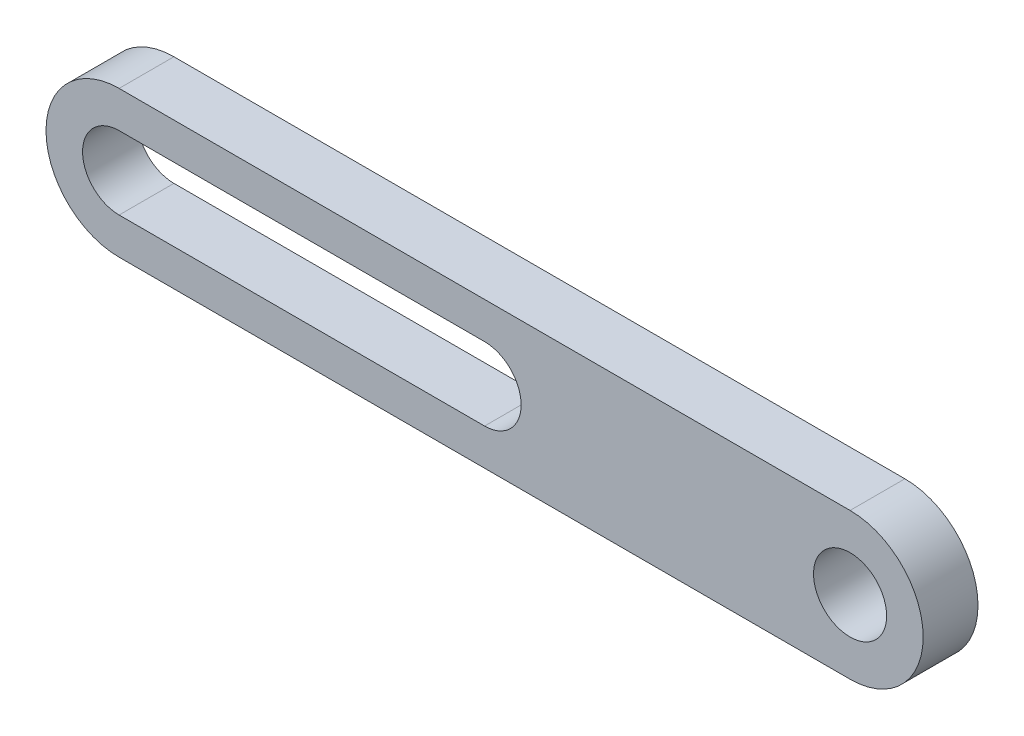
ISO-10303-21;
HEADER;
FILE_DESCRIPTION(('STEP AP214'),'2;1');
FILE_NAME('part.step','',(''),(''),'','','');
FILE_SCHEMA(('AUTOMOTIVE_DESIGN { 1 0 10303 214 1 1 1 1 }'));
ENDSEC;
DATA;
#1=APPLICATION_CONTEXT('core data for automotive mechanical design processes');
#2=APPLICATION_PROTOCOL_DEFINITION('international standard','automotive_design',2000,#1);
#3=PRODUCT_CONTEXT('',#1,'mechanical');
#4=PRODUCT('Part','Part','',(#3));
#5=PRODUCT_RELATED_PRODUCT_CATEGORY('part','',(#4));
#6=PRODUCT_DEFINITION_FORMATION('','',#4);
#7=PRODUCT_DEFINITION_CONTEXT('part definition',#1,'design');
#8=PRODUCT_DEFINITION('design','',#6,#7);
#9=PRODUCT_DEFINITION_SHAPE('','',#8);
#10=(LENGTH_UNIT() NAMED_UNIT(*) SI_UNIT(.MILLI.,.METRE.));
#11=(NAMED_UNIT(*) PLANE_ANGLE_UNIT() SI_UNIT($,.RADIAN.));
#12=(NAMED_UNIT(*) SI_UNIT($,.STERADIAN.) SOLID_ANGLE_UNIT());
#13=UNCERTAINTY_MEASURE_WITH_UNIT(LENGTH_MEASURE(1.E-05),#10,'distance_accuracy_value','');
#14=(GEOMETRIC_REPRESENTATION_CONTEXT(3) GLOBAL_UNCERTAINTY_ASSIGNED_CONTEXT((#13)) GLOBAL_UNIT_ASSIGNED_CONTEXT((#10,
#11,#12)) REPRESENTATION_CONTEXT('',''));
#15=CARTESIAN_POINT('',(0.,0.,0.));
#16=DIRECTION('',(0.,0.,1.));
#17=DIRECTION('',(1.,0.,0.));
#18=AXIS2_PLACEMENT_3D('',#15,#16,#17);
#19=CARTESIAN_POINT('',(-10.,0.,1.5));
#20=DIRECTION('',(0.,0.,1.));
#21=DIRECTION('',(1.,0.,0.));
#22=AXIS2_PLACEMENT_3D('',#19,#20,#21);
#23=PLANE('',#22);
#24=CARTESIAN_POINT('',(-10.,0.,1.5));
#25=DIRECTION('',(0.,0.,1.));
#26=DIRECTION('',(1.,0.,0.));
#27=AXIS2_PLACEMENT_3D('',#24,#25,#26);
#28=CIRCLE('',#27,2.);
#29=CARTESIAN_POINT('',(-10.,2.,1.5));
#30=VERTEX_POINT('',#29);
#31=CARTESIAN_POINT('',(-10.,-2.,1.5));
#32=VERTEX_POINT('',#31);
#33=EDGE_CURVE('E165',#30,#32,#28,.T.);
#34=ORIENTED_EDGE('',*,*,#33,.T.);
#35=DIRECTION('',(1.,0.,0.));
#36=VECTOR('',#35,1.);
#37=CARTESIAN_POINT('',(-10.,-2.,1.5));
#38=LINE('',#37,#36);
#39=CARTESIAN_POINT('',(10.,-2.,1.5));
#40=VERTEX_POINT('',#39);
#41=EDGE_CURVE('E169',#32,#40,#38,.T.);
#42=ORIENTED_EDGE('',*,*,#41,.T.);
#43=CARTESIAN_POINT('',(10.,0.,1.5));
#44=DIRECTION('',(0.,0.,1.));
#45=DIRECTION('',(1.,0.,0.));
#46=AXIS2_PLACEMENT_3D('',#43,#44,#45);
#47=CIRCLE('',#46,2.);
#48=CARTESIAN_POINT('',(10.,2.,1.5));
#49=VERTEX_POINT('',#48);
#50=EDGE_CURVE('E173',#40,#49,#47,.T.);
#51=ORIENTED_EDGE('',*,*,#50,.T.);
#52=DIRECTION('',(-1.,0.,0.));
#53=VECTOR('',#52,1.);
#54=CARTESIAN_POINT('',(-10.,2.,1.5));
#55=LINE('',#54,#53);
#56=EDGE_CURVE('E176',#49,#30,#55,.T.);
#57=ORIENTED_EDGE('',*,*,#56,.T.);
#58=EDGE_LOOP('',(#34,#42,#51,#57));
#59=FACE_BOUND('',#58,.T.);
#60=CARTESIAN_POINT('',(10.,0.,1.5));
#61=DIRECTION('',(0.,0.,1.));
#62=DIRECTION('',(1.,0.,0.));
#63=AXIS2_PLACEMENT_3D('',#60,#61,#62);
#64=CIRCLE('',#63,1.);
#65=CARTESIAN_POINT('',(11.,0.,1.5));
#66=VERTEX_POINT('',#65);
#67=EDGE_CURVE('E157',#66,#66,#64,.T.);
#68=ORIENTED_EDGE('',*,*,#67,.F.);
#69=EDGE_LOOP('',(#68));
#70=FACE_BOUND('',#69,.T.);
#71=DIRECTION('',(1.,0.,0.));
#72=VECTOR('',#71,1.);
#73=CARTESIAN_POINT('',(-10.,-1.,1.5));
#74=LINE('',#73,#72);
#75=CARTESIAN_POINT('',(-10.,-1.,1.5));
#76=VERTEX_POINT('',#75);
#77=CARTESIAN_POINT('',(0.,-1.,1.5));
#78=VERTEX_POINT('',#77);
#79=EDGE_CURVE('E118',#76,#78,#74,.T.);
#80=ORIENTED_EDGE('',*,*,#79,.F.);
#81=CARTESIAN_POINT('',(-10.,0.,1.5));
#82=DIRECTION('',(0.,0.,1.));
#83=DIRECTION('',(1.,0.,0.));
#84=AXIS2_PLACEMENT_3D('',#81,#82,#83);
#85=CIRCLE('',#84,1.);
#86=CARTESIAN_POINT('',(-10.,1.,1.5));
#87=VERTEX_POINT('',#86);
#88=EDGE_CURVE('E109',#87,#76,#85,.T.);
#89=ORIENTED_EDGE('',*,*,#88,.F.);
#90=DIRECTION('',(-1.,0.,0.));
#91=VECTOR('',#90,1.);
#92=CARTESIAN_POINT('',(-10.,1.,1.5));
#93=LINE('',#92,#91);
#94=CARTESIAN_POINT('',(0.,1.,1.5));
#95=VERTEX_POINT('',#94);
#96=EDGE_CURVE('E135',#95,#87,#93,.T.);
#97=ORIENTED_EDGE('',*,*,#96,.F.);
#98=CARTESIAN_POINT('',(0.,0.,1.5));
#99=DIRECTION('',(0.,0.,1.));
#100=DIRECTION('',(1.,0.,0.));
#101=AXIS2_PLACEMENT_3D('',#98,#99,#100);
#102=CIRCLE('',#101,1.);
#103=EDGE_CURVE('E131',#78,#95,#102,.T.);
#104=ORIENTED_EDGE('',*,*,#103,.F.);
#105=EDGE_LOOP('',(#80,#89,#97,#104));
#106=FACE_BOUND('',#105,.T.);
#107=ADVANCED_FACE('F43',(#59,#70,#106),#23,.T.);
#108=CARTESIAN_POINT('',(-10.,0.,0.));
#109=DIRECTION('',(0.,0.,1.));
#110=DIRECTION('',(1.,0.,0.));
#111=AXIS2_PLACEMENT_3D('',#108,#109,#110);
#112=PLANE('',#111);
#113=CARTESIAN_POINT('',(10.,0.,0.));
#114=DIRECTION('',(0.,0.,1.));
#115=DIRECTION('',(1.,0.,0.));
#116=AXIS2_PLACEMENT_3D('',#113,#114,#115);
#117=CIRCLE('',#116,1.);
#118=CARTESIAN_POINT('',(11.,0.,0.));
#119=VERTEX_POINT('',#118);
#120=EDGE_CURVE('E127',#119,#119,#117,.T.);
#121=ORIENTED_EDGE('',*,*,#120,.T.);
#122=EDGE_LOOP('',(#121));
#123=FACE_BOUND('',#122,.T.);
#124=CARTESIAN_POINT('',(-10.,0.,0.));
#125=DIRECTION('',(0.,0.,1.));
#126=DIRECTION('',(1.,0.,0.));
#127=AXIS2_PLACEMENT_3D('',#124,#125,#126);
#128=CIRCLE('',#127,2.);
#129=CARTESIAN_POINT('',(-10.,2.,0.));
#130=VERTEX_POINT('',#129);
#131=CARTESIAN_POINT('',(-10.,-2.,0.));
#132=VERTEX_POINT('',#131);
#133=EDGE_CURVE('E161',#130,#132,#128,.T.);
#134=ORIENTED_EDGE('',*,*,#133,.F.);
#135=DIRECTION('',(-1.,0.,0.));
#136=VECTOR('',#135,1.);
#137=CARTESIAN_POINT('',(-10.,2.,0.));
#138=LINE('',#137,#136);
#139=CARTESIAN_POINT('',(10.,2.,0.));
#140=VERTEX_POINT('',#139);
#141=EDGE_CURVE('E170',#140,#130,#138,.T.);
#142=ORIENTED_EDGE('',*,*,#141,.F.);
#143=CARTESIAN_POINT('',(10.,0.,0.));
#144=DIRECTION('',(0.,0.,1.));
#145=DIRECTION('',(1.,0.,0.));
#146=AXIS2_PLACEMENT_3D('',#143,#144,#145);
#147=CIRCLE('',#146,2.);
#148=CARTESIAN_POINT('',(10.,-2.,0.));
#149=VERTEX_POINT('',#148);
#150=EDGE_CURVE('E186',#149,#140,#147,.T.);
#151=ORIENTED_EDGE('',*,*,#150,.F.);
#152=DIRECTION('',(1.,0.,0.));
#153=VECTOR('',#152,1.);
#154=CARTESIAN_POINT('',(-10.,-2.,0.));
#155=LINE('',#154,#153);
#156=EDGE_CURVE('E183',#132,#149,#155,.T.);
#157=ORIENTED_EDGE('',*,*,#156,.F.);
#158=EDGE_LOOP('',(#134,#142,#151,#157));
#159=FACE_BOUND('',#158,.T.);
#160=CARTESIAN_POINT('',(-10.,0.,0.));
#161=DIRECTION('',(0.,0.,1.));
#162=DIRECTION('',(1.,0.,0.));
#163=AXIS2_PLACEMENT_3D('',#160,#161,#162);
#164=CIRCLE('',#163,1.);
#165=CARTESIAN_POINT('',(-10.,1.,0.));
#166=VERTEX_POINT('',#165);
#167=CARTESIAN_POINT('',(-10.,-1.,0.));
#168=VERTEX_POINT('',#167);
#169=EDGE_CURVE('E67',#166,#168,#164,.T.);
#170=ORIENTED_EDGE('',*,*,#169,.T.);
#171=DIRECTION('',(1.,0.,0.));
#172=VECTOR('',#171,1.);
#173=CARTESIAN_POINT('',(-10.,-1.,0.));
#174=LINE('',#173,#172);
#175=CARTESIAN_POINT('',(0.,-1.,0.));
#176=VERTEX_POINT('',#175);
#177=EDGE_CURVE('E125',#168,#176,#174,.T.);
#178=ORIENTED_EDGE('',*,*,#177,.T.);
#179=CARTESIAN_POINT('',(0.,0.,0.));
#180=DIRECTION('',(0.,0.,1.));
#181=DIRECTION('',(1.,0.,0.));
#182=AXIS2_PLACEMENT_3D('',#179,#180,#181);
#183=CIRCLE('',#182,1.);
#184=CARTESIAN_POINT('',(0.,1.,0.));
#185=VERTEX_POINT('',#184);
#186=EDGE_CURVE('E144',#176,#185,#183,.T.);
#187=ORIENTED_EDGE('',*,*,#186,.T.);
#188=DIRECTION('',(-1.,0.,0.));
#189=VECTOR('',#188,1.);
#190=CARTESIAN_POINT('',(-10.,1.,0.));
#191=LINE('',#190,#189);
#192=EDGE_CURVE('E119',#185,#166,#191,.T.);
#193=ORIENTED_EDGE('',*,*,#192,.T.);
#194=EDGE_LOOP('',(#170,#178,#187,#193));
#195=FACE_BOUND('',#194,.T.);
#196=ADVANCED_FACE('F209',(#123,#159,#195),#112,.F.);
#197=CARTESIAN_POINT('',(-10.,0.,1.5));
#198=DIRECTION('',(0.,0.,-1.));
#199=DIRECTION('',(-1.,0.,0.));
#200=AXIS2_PLACEMENT_3D('',#197,#198,#199);
#201=CYLINDRICAL_SURFACE('',#200,2.);
#202=ORIENTED_EDGE('',*,*,#133,.T.);
#203=DIRECTION('',(0.,0.,-1.));
#204=VECTOR('',#203,1.);
#205=CARTESIAN_POINT('',(-10.,-2.,1.5));
#206=LINE('',#205,#204);
#207=EDGE_CURVE('E11',#32,#132,#206,.T.);
#208=ORIENTED_EDGE('',*,*,#207,.F.);
#209=ORIENTED_EDGE('',*,*,#33,.F.);
#210=DIRECTION('',(0.,0.,-1.));
#211=VECTOR('',#210,1.);
#212=CARTESIAN_POINT('',(-10.,2.,1.5));
#213=LINE('',#212,#211);
#214=EDGE_CURVE('E179',#30,#130,#213,.T.);
#215=ORIENTED_EDGE('',*,*,#214,.T.);
#216=EDGE_LOOP('',(#202,#208,#209,#215));
#217=FACE_BOUND('',#216,.T.);
#218=ADVANCED_FACE('F45',(#217),#201,.T.);
#219=CARTESIAN_POINT('',(-10.,-2.,1.5));
#220=DIRECTION('',(0.,1.,0.));
#221=DIRECTION('',(-1.,0.,0.));
#222=AXIS2_PLACEMENT_3D('',#219,#220,#221);
#223=PLANE('',#222);
#224=ORIENTED_EDGE('',*,*,#156,.T.);
#225=DIRECTION('',(0.,0.,-1.));
#226=VECTOR('',#225,1.);
#227=CARTESIAN_POINT('',(10.,-2.,1.5));
#228=LINE('',#227,#226);
#229=EDGE_CURVE('E52',#40,#149,#228,.T.);
#230=ORIENTED_EDGE('',*,*,#229,.F.);
#231=ORIENTED_EDGE('',*,*,#41,.F.);
#232=ORIENTED_EDGE('',*,*,#207,.T.);
#233=EDGE_LOOP('',(#224,#230,#231,#232));
#234=FACE_BOUND('',#233,.T.);
#235=ADVANCED_FACE('F220',(#234),#223,.F.);
#236=CARTESIAN_POINT('',(10.,0.,1.5));
#237=DIRECTION('',(0.,0.,-1.));
#238=DIRECTION('',(-1.,0.,0.));
#239=AXIS2_PLACEMENT_3D('',#236,#237,#238);
#240=CYLINDRICAL_SURFACE('',#239,2.);
#241=ORIENTED_EDGE('',*,*,#150,.T.);
#242=DIRECTION('',(0.,0.,-1.));
#243=VECTOR('',#242,1.);
#244=CARTESIAN_POINT('',(10.,2.,1.5));
#245=LINE('',#244,#243);
#246=EDGE_CURVE('E194',#49,#140,#245,.T.);
#247=ORIENTED_EDGE('',*,*,#246,.F.);
#248=ORIENTED_EDGE('',*,*,#50,.F.);
#249=ORIENTED_EDGE('',*,*,#229,.T.);
#250=EDGE_LOOP('',(#241,#247,#248,#249));
#251=FACE_BOUND('',#250,.T.);
#252=ADVANCED_FACE('F203',(#251),#240,.T.);
#253=CARTESIAN_POINT('',(-10.,2.,1.5));
#254=DIRECTION('',(0.,-1.,0.));
#255=DIRECTION('',(1.,0.,0.));
#256=AXIS2_PLACEMENT_3D('',#253,#254,#255);
#257=PLANE('',#256);
#258=ORIENTED_EDGE('',*,*,#141,.T.);
#259=ORIENTED_EDGE('',*,*,#214,.F.);
#260=ORIENTED_EDGE('',*,*,#56,.F.);
#261=ORIENTED_EDGE('',*,*,#246,.T.);
#262=EDGE_LOOP('',(#258,#259,#260,#261));
#263=FACE_BOUND('',#262,.T.);
#264=ADVANCED_FACE('F213',(#263),#257,.F.);
#265=CARTESIAN_POINT('',(10.,0.,1.5));
#266=DIRECTION('',(0.,0.,-1.));
#267=DIRECTION('',(-1.,0.,0.));
#268=AXIS2_PLACEMENT_3D('',#265,#266,#267);
#269=CYLINDRICAL_SURFACE('',#268,1.);
#270=ORIENTED_EDGE('',*,*,#67,.T.);
#271=EDGE_LOOP('',(#270));
#272=FACE_BOUND('',#271,.T.);
#273=ORIENTED_EDGE('',*,*,#120,.F.);
#274=EDGE_LOOP('',(#273));
#275=FACE_BOUND('',#274,.T.);
#276=ADVANCED_FACE('F235',(#272,#275),#269,.F.);
#277=CARTESIAN_POINT('',(-10.,0.,1.5));
#278=DIRECTION('',(0.,0.,-1.));
#279=DIRECTION('',(-1.,0.,0.));
#280=AXIS2_PLACEMENT_3D('',#277,#278,#279);
#281=CYLINDRICAL_SURFACE('',#280,1.);
#282=ORIENTED_EDGE('',*,*,#169,.F.);
#283=DIRECTION('',(0.,0.,-1.));
#284=VECTOR('',#283,1.);
#285=CARTESIAN_POINT('',(-10.,1.,1.5));
#286=LINE('',#285,#284);
#287=EDGE_CURVE('E113',#87,#166,#286,.T.);
#288=ORIENTED_EDGE('',*,*,#287,.F.);
#289=ORIENTED_EDGE('',*,*,#88,.T.);
#290=DIRECTION('',(0.,0.,-1.));
#291=VECTOR('',#290,1.);
#292=CARTESIAN_POINT('',(-10.,-1.,1.5));
#293=LINE('',#292,#291);
#294=EDGE_CURVE('E112',#76,#168,#293,.T.);
#295=ORIENTED_EDGE('',*,*,#294,.T.);
#296=EDGE_LOOP('',(#282,#288,#289,#295));
#297=FACE_BOUND('',#296,.T.);
#298=ADVANCED_FACE('F111',(#297),#281,.F.);
#299=CARTESIAN_POINT('',(-10.,-1.,1.5));
#300=DIRECTION('',(0.,1.,0.));
#301=DIRECTION('',(0.,0.,1.));
#302=AXIS2_PLACEMENT_3D('',#299,#300,#301);
#303=PLANE('',#302);
#304=ORIENTED_EDGE('',*,*,#177,.F.);
#305=ORIENTED_EDGE('',*,*,#294,.F.);
#306=ORIENTED_EDGE('',*,*,#79,.T.);
#307=DIRECTION('',(0.,0.,-1.));
#308=VECTOR('',#307,1.);
#309=CARTESIAN_POINT('',(0.,-1.,1.5));
#310=LINE('',#309,#308);
#311=EDGE_CURVE('E128',#78,#176,#310,.T.);
#312=ORIENTED_EDGE('',*,*,#311,.T.);
#313=EDGE_LOOP('',(#304,#305,#306,#312));
#314=FACE_BOUND('',#313,.T.);
#315=ADVANCED_FACE('F122',(#314),#303,.T.);
#316=CARTESIAN_POINT('',(0.,0.,1.5));
#317=DIRECTION('',(0.,0.,-1.));
#318=DIRECTION('',(-1.,0.,0.));
#319=AXIS2_PLACEMENT_3D('',#316,#317,#318);
#320=CYLINDRICAL_SURFACE('',#319,1.);
#321=ORIENTED_EDGE('',*,*,#186,.F.);
#322=ORIENTED_EDGE('',*,*,#311,.F.);
#323=ORIENTED_EDGE('',*,*,#103,.T.);
#324=DIRECTION('',(0.,0.,-1.));
#325=VECTOR('',#324,1.);
#326=CARTESIAN_POINT('',(0.,1.,1.5));
#327=LINE('',#326,#325);
#328=EDGE_CURVE('E59',#95,#185,#327,.T.);
#329=ORIENTED_EDGE('',*,*,#328,.T.);
#330=EDGE_LOOP('',(#321,#322,#323,#329));
#331=FACE_BOUND('',#330,.T.);
#332=ADVANCED_FACE('F252',(#331),#320,.F.);
#333=CARTESIAN_POINT('',(-10.,1.,1.5));
#334=DIRECTION('',(0.,-1.,0.));
#335=DIRECTION('',(0.,0.,-1.));
#336=AXIS2_PLACEMENT_3D('',#333,#334,#335);
#337=PLANE('',#336);
#338=ORIENTED_EDGE('',*,*,#192,.F.);
#339=ORIENTED_EDGE('',*,*,#328,.F.);
#340=ORIENTED_EDGE('',*,*,#96,.T.);
#341=ORIENTED_EDGE('',*,*,#287,.T.);
#342=EDGE_LOOP('',(#338,#339,#340,#341));
#343=FACE_BOUND('',#342,.T.);
#344=ADVANCED_FACE('F257',(#343),#337,.T.);
#345=CLOSED_SHELL('',(#107,#196,#218,#235,#252,#264,#276,#298,#315,#332,#344));
#346=MANIFOLD_SOLID_BREP('B2',#345);
#347=ADVANCED_BREP_SHAPE_REPRESENTATION('',(#18,#346),#14);
#348=SHAPE_DEFINITION_REPRESENTATION(#9,#347);
ENDSEC;
END-ISO-10303-21;
